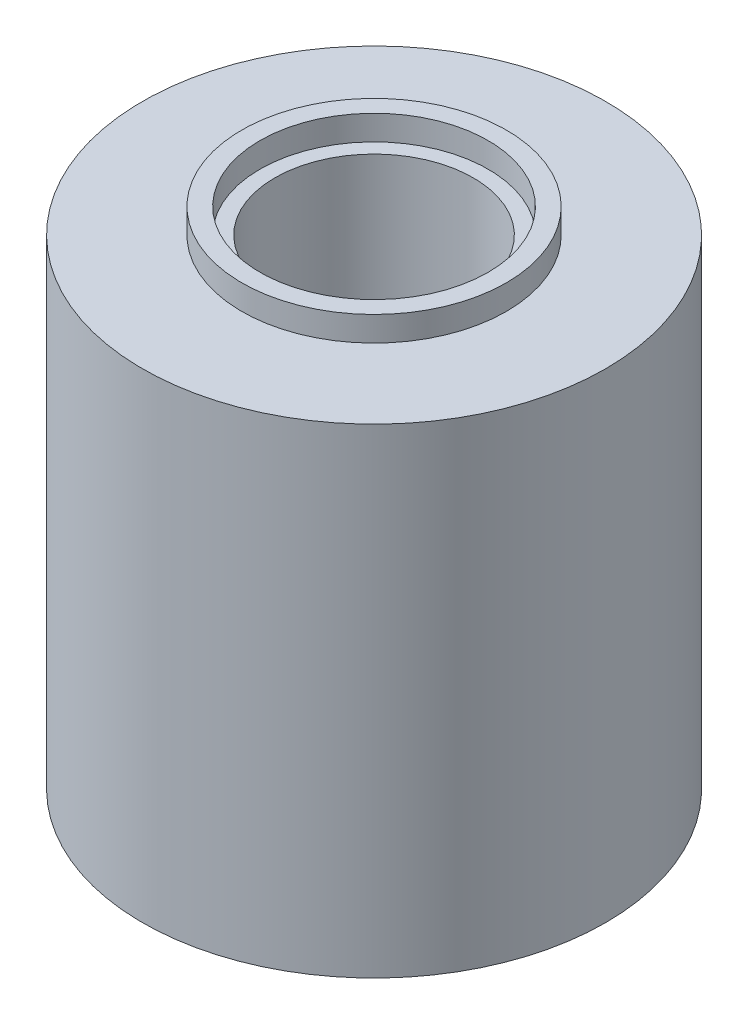
ISO-10303-21;
HEADER;
FILE_DESCRIPTION(('STEP AP214'),'2;1');
FILE_NAME('part.step','',(''),(''),'','','');
FILE_SCHEMA(('AUTOMOTIVE_DESIGN { 1 0 10303 214 1 1 1 1 }'));
ENDSEC;
DATA;
#1=APPLICATION_CONTEXT('core data for automotive mechanical design processes');
#2=APPLICATION_PROTOCOL_DEFINITION('international standard','automotive_design',2000,#1);
#3=PRODUCT_CONTEXT('',#1,'mechanical');
#4=PRODUCT('Part','Part','',(#3));
#5=PRODUCT_RELATED_PRODUCT_CATEGORY('part','',(#4));
#6=PRODUCT_DEFINITION_FORMATION('','',#4);
#7=PRODUCT_DEFINITION_CONTEXT('part definition',#1,'design');
#8=PRODUCT_DEFINITION('design','',#6,#7);
#9=PRODUCT_DEFINITION_SHAPE('','',#8);
#10=(LENGTH_UNIT() NAMED_UNIT(*) SI_UNIT(.MILLI.,.METRE.));
#11=(NAMED_UNIT(*) PLANE_ANGLE_UNIT() SI_UNIT($,.RADIAN.));
#12=(NAMED_UNIT(*) SI_UNIT($,.STERADIAN.) SOLID_ANGLE_UNIT());
#13=UNCERTAINTY_MEASURE_WITH_UNIT(LENGTH_MEASURE(1.E-05),#10,'distance_accuracy_value','');
#14=(GEOMETRIC_REPRESENTATION_CONTEXT(3) GLOBAL_UNCERTAINTY_ASSIGNED_CONTEXT((#13)) GLOBAL_UNIT_ASSIGNED_CONTEXT((#10,
#11,#12)) REPRESENTATION_CONTEXT('',''));
#15=CARTESIAN_POINT('',(0.,0.,0.));
#16=DIRECTION('',(0.,0.,1.));
#17=DIRECTION('',(1.,0.,0.));
#18=AXIS2_PLACEMENT_3D('',#15,#16,#17);
#19=CARTESIAN_POINT('',(8.,0.,0.));
#20=DIRECTION('',(0.,-1.,0.));
#21=DIRECTION('',(1.,0.,0.));
#22=AXIS2_PLACEMENT_3D('',#19,#20,#21);
#23=PLANE('',#22);
#24=CARTESIAN_POINT('',(0.,0.,0.));
#25=DIRECTION('',(0.,-1.,0.));
#26=DIRECTION('',(1.,0.,0.));
#27=AXIS2_PLACEMENT_3D('',#24,#25,#26);
#28=CIRCLE('',#27,8.);
#29=CARTESIAN_POINT('',(8.,0.,0.));
#30=VERTEX_POINT('',#29);
#31=EDGE_CURVE('E70',#30,#30,#28,.T.);
#32=ORIENTED_EDGE('',*,*,#31,.T.);
#33=EDGE_LOOP('',(#32));
#34=FACE_BOUND('',#33,.T.);
#35=CARTESIAN_POINT('',(0.,0.,0.));
#36=DIRECTION('',(0.,-1.,0.));
#37=DIRECTION('',(1.,0.,0.));
#38=AXIS2_PLACEMENT_3D('',#35,#36,#37);
#39=CIRCLE('',#38,6.9);
#40=CARTESIAN_POINT('',(6.9,0.,0.));
#41=VERTEX_POINT('',#40);
#42=EDGE_CURVE('E10',#41,#41,#39,.T.);
#43=ORIENTED_EDGE('',*,*,#42,.F.);
#44=EDGE_LOOP('',(#43));
#45=FACE_BOUND('',#44,.T.);
#46=ADVANCED_FACE('F30',(#34,#45),#23,.T.);
#47=CARTESIAN_POINT('',(0.,0.,0.));
#48=DIRECTION('',(0.,-1.,0.));
#49=DIRECTION('',(1.,0.,0.));
#50=AXIS2_PLACEMENT_3D('',#47,#48,#49);
#51=CYLINDRICAL_SURFACE('',#50,6.9);
#52=ORIENTED_EDGE('',*,*,#42,.T.);
#53=EDGE_LOOP('',(#52));
#54=FACE_BOUND('',#53,.T.);
#55=CARTESIAN_POINT('',(0.,1.5,0.));
#56=DIRECTION('',(0.,-1.,0.));
#57=DIRECTION('',(1.,0.,0.));
#58=AXIS2_PLACEMENT_3D('',#55,#56,#57);
#59=CIRCLE('',#58,6.9);
#60=CARTESIAN_POINT('',(6.9,1.5,0.));
#61=VERTEX_POINT('',#60);
#62=EDGE_CURVE('E36',#61,#61,#59,.T.);
#63=ORIENTED_EDGE('',*,*,#62,.F.);
#64=EDGE_LOOP('',(#63));
#65=FACE_BOUND('',#64,.T.);
#66=ADVANCED_FACE('F88',(#54,#65),#51,.F.);
#67=CARTESIAN_POINT('',(6.9,1.5,0.));
#68=DIRECTION('',(0.,-1.,0.));
#69=DIRECTION('',(1.,0.,0.));
#70=AXIS2_PLACEMENT_3D('',#67,#68,#69);
#71=PLANE('',#70);
#72=ORIENTED_EDGE('',*,*,#62,.T.);
#73=EDGE_LOOP('',(#72));
#74=FACE_BOUND('',#73,.T.);
#75=CARTESIAN_POINT('',(0.,1.5,0.));
#76=DIRECTION('',(0.,-1.,0.));
#77=DIRECTION('',(1.,0.,0.));
#78=AXIS2_PLACEMENT_3D('',#75,#76,#77);
#79=CIRCLE('',#78,6.);
#80=CARTESIAN_POINT('',(6.,1.5,0.));
#81=VERTEX_POINT('',#80);
#82=EDGE_CURVE('E40',#81,#81,#79,.T.);
#83=ORIENTED_EDGE('',*,*,#82,.F.);
#84=EDGE_LOOP('',(#83));
#85=FACE_BOUND('',#84,.T.);
#86=ADVANCED_FACE('F92',(#74,#85),#71,.T.);
#87=CARTESIAN_POINT('',(0.,0.,0.));
#88=DIRECTION('',(0.,-1.,0.));
#89=DIRECTION('',(1.,0.,0.));
#90=AXIS2_PLACEMENT_3D('',#87,#88,#89);
#91=CYLINDRICAL_SURFACE('',#90,6.);
#92=ORIENTED_EDGE('',*,*,#82,.T.);
#93=EDGE_LOOP('',(#92));
#94=FACE_BOUND('',#93,.T.);
#95=CARTESIAN_POINT('',(0.,30.5,0.));
#96=DIRECTION('',(0.,-1.,0.));
#97=DIRECTION('',(1.,0.,0.));
#98=AXIS2_PLACEMENT_3D('',#95,#96,#97);
#99=CIRCLE('',#98,6.);
#100=CARTESIAN_POINT('',(6.,30.5,0.));
#101=VERTEX_POINT('',#100);
#102=EDGE_CURVE('E44',#101,#101,#99,.T.);
#103=ORIENTED_EDGE('',*,*,#102,.F.);
#104=EDGE_LOOP('',(#103));
#105=FACE_BOUND('',#104,.T.);
#106=ADVANCED_FACE('F96',(#94,#105),#91,.F.);
#107=CARTESIAN_POINT('',(6.9,30.5,0.));
#108=DIRECTION('',(0.,1.,0.));
#109=DIRECTION('',(-1.,0.,0.));
#110=AXIS2_PLACEMENT_3D('',#107,#108,#109);
#111=PLANE('',#110);
#112=ORIENTED_EDGE('',*,*,#102,.T.);
#113=EDGE_LOOP('',(#112));
#114=FACE_BOUND('',#113,.T.);
#115=CARTESIAN_POINT('',(0.,30.5,0.));
#116=DIRECTION('',(0.,-1.,0.));
#117=DIRECTION('',(1.,0.,0.));
#118=AXIS2_PLACEMENT_3D('',#115,#116,#117);
#119=CIRCLE('',#118,6.9);
#120=CARTESIAN_POINT('',(6.9,30.5,0.));
#121=VERTEX_POINT('',#120);
#122=EDGE_CURVE('E49',#121,#121,#119,.T.);
#123=ORIENTED_EDGE('',*,*,#122,.F.);
#124=EDGE_LOOP('',(#123));
#125=FACE_BOUND('',#124,.T.);
#126=ADVANCED_FACE('F102',(#114,#125),#111,.T.);
#127=CARTESIAN_POINT('',(0.,0.,0.));
#128=DIRECTION('',(0.,-1.,0.));
#129=DIRECTION('',(1.,0.,0.));
#130=AXIS2_PLACEMENT_3D('',#127,#128,#129);
#131=CYLINDRICAL_SURFACE('',#130,6.9);
#132=ORIENTED_EDGE('',*,*,#122,.T.);
#133=EDGE_LOOP('',(#132));
#134=FACE_BOUND('',#133,.T.);
#135=CARTESIAN_POINT('',(0.,32.,0.));
#136=DIRECTION('',(0.,-1.,0.));
#137=DIRECTION('',(1.,0.,0.));
#138=AXIS2_PLACEMENT_3D('',#135,#136,#137);
#139=CIRCLE('',#138,6.9);
#140=CARTESIAN_POINT('',(6.9,32.,0.));
#141=VERTEX_POINT('',#140);
#142=EDGE_CURVE('E52',#141,#141,#139,.T.);
#143=ORIENTED_EDGE('',*,*,#142,.F.);
#144=EDGE_LOOP('',(#143));
#145=FACE_BOUND('',#144,.T.);
#146=ADVANCED_FACE('F106',(#134,#145),#131,.F.);
#147=CARTESIAN_POINT('',(8.,32.,0.));
#148=DIRECTION('',(0.,1.,0.));
#149=DIRECTION('',(-1.,0.,0.));
#150=AXIS2_PLACEMENT_3D('',#147,#148,#149);
#151=PLANE('',#150);
#152=ORIENTED_EDGE('',*,*,#142,.T.);
#153=EDGE_LOOP('',(#152));
#154=FACE_BOUND('',#153,.T.);
#155=CARTESIAN_POINT('',(0.,32.,0.));
#156=DIRECTION('',(0.,-1.,0.));
#157=DIRECTION('',(1.,0.,0.));
#158=AXIS2_PLACEMENT_3D('',#155,#156,#157);
#159=CIRCLE('',#158,8.);
#160=CARTESIAN_POINT('',(8.,32.,0.));
#161=VERTEX_POINT('',#160);
#162=EDGE_CURVE('E55',#161,#161,#159,.T.);
#163=ORIENTED_EDGE('',*,*,#162,.F.);
#164=EDGE_LOOP('',(#163));
#165=FACE_BOUND('',#164,.T.);
#166=ADVANCED_FACE('F110',(#154,#165),#151,.T.);
#167=CARTESIAN_POINT('',(0.,0.,0.));
#168=DIRECTION('',(0.,-1.,0.));
#169=DIRECTION('',(1.,0.,0.));
#170=AXIS2_PLACEMENT_3D('',#167,#168,#169);
#171=CYLINDRICAL_SURFACE('',#170,8.);
#172=ORIENTED_EDGE('',*,*,#162,.T.);
#173=EDGE_LOOP('',(#172));
#174=FACE_BOUND('',#173,.T.);
#175=CARTESIAN_POINT('',(0.,30.5,0.));
#176=DIRECTION('',(0.,-1.,0.));
#177=DIRECTION('',(1.,0.,0.));
#178=AXIS2_PLACEMENT_3D('',#175,#176,#177);
#179=CIRCLE('',#178,8.);
#180=CARTESIAN_POINT('',(8.,30.5,0.));
#181=VERTEX_POINT('',#180);
#182=EDGE_CURVE('E58',#181,#181,#179,.T.);
#183=ORIENTED_EDGE('',*,*,#182,.F.);
#184=EDGE_LOOP('',(#183));
#185=FACE_BOUND('',#184,.T.);
#186=ADVANCED_FACE('F114',(#174,#185),#171,.T.);
#187=CARTESIAN_POINT('',(8.,30.5,0.));
#188=DIRECTION('',(0.,1.,0.));
#189=DIRECTION('',(-1.,0.,0.));
#190=AXIS2_PLACEMENT_3D('',#187,#188,#189);
#191=PLANE('',#190);
#192=ORIENTED_EDGE('',*,*,#182,.T.);
#193=EDGE_LOOP('',(#192));
#194=FACE_BOUND('',#193,.T.);
#195=CARTESIAN_POINT('',(0.,30.5,0.));
#196=DIRECTION('',(0.,-1.,0.));
#197=DIRECTION('',(1.,0.,0.));
#198=AXIS2_PLACEMENT_3D('',#195,#196,#197);
#199=CIRCLE('',#198,14.);
#200=CARTESIAN_POINT('',(14.,30.5,0.));
#201=VERTEX_POINT('',#200);
#202=EDGE_CURVE('E61',#201,#201,#199,.T.);
#203=ORIENTED_EDGE('',*,*,#202,.F.);
#204=EDGE_LOOP('',(#203));
#205=FACE_BOUND('',#204,.T.);
#206=ADVANCED_FACE('F118',(#194,#205),#191,.T.);
#207=CARTESIAN_POINT('',(0.,0.,0.));
#208=DIRECTION('',(0.,-1.,0.));
#209=DIRECTION('',(1.,0.,0.));
#210=AXIS2_PLACEMENT_3D('',#207,#208,#209);
#211=CYLINDRICAL_SURFACE('',#210,14.);
#212=ORIENTED_EDGE('',*,*,#202,.T.);
#213=EDGE_LOOP('',(#212));
#214=FACE_BOUND('',#213,.T.);
#215=CARTESIAN_POINT('',(0.,1.5,0.));
#216=DIRECTION('',(0.,-1.,0.));
#217=DIRECTION('',(1.,0.,0.));
#218=AXIS2_PLACEMENT_3D('',#215,#216,#217);
#219=CIRCLE('',#218,14.);
#220=CARTESIAN_POINT('',(14.,1.5,0.));
#221=VERTEX_POINT('',#220);
#222=EDGE_CURVE('E64',#221,#221,#219,.T.);
#223=ORIENTED_EDGE('',*,*,#222,.F.);
#224=EDGE_LOOP('',(#223));
#225=FACE_BOUND('',#224,.T.);
#226=ADVANCED_FACE('F84',(#214,#225),#211,.T.);
#227=CARTESIAN_POINT('',(8.,1.5,0.));
#228=DIRECTION('',(0.,-1.,0.));
#229=DIRECTION('',(1.,0.,0.));
#230=AXIS2_PLACEMENT_3D('',#227,#228,#229);
#231=PLANE('',#230);
#232=ORIENTED_EDGE('',*,*,#222,.T.);
#233=EDGE_LOOP('',(#232));
#234=FACE_BOUND('',#233,.T.);
#235=CARTESIAN_POINT('',(0.,1.5,0.));
#236=DIRECTION('',(0.,-1.,0.));
#237=DIRECTION('',(1.,0.,0.));
#238=AXIS2_PLACEMENT_3D('',#235,#236,#237);
#239=CIRCLE('',#238,8.);
#240=CARTESIAN_POINT('',(8.,1.5,0.));
#241=VERTEX_POINT('',#240);
#242=EDGE_CURVE('E67',#241,#241,#239,.T.);
#243=ORIENTED_EDGE('',*,*,#242,.F.);
#244=EDGE_LOOP('',(#243));
#245=FACE_BOUND('',#244,.T.);
#246=ADVANCED_FACE('F78',(#234,#245),#231,.T.);
#247=CARTESIAN_POINT('',(0.,0.,0.));
#248=DIRECTION('',(0.,-1.,0.));
#249=DIRECTION('',(1.,0.,0.));
#250=AXIS2_PLACEMENT_3D('',#247,#248,#249);
#251=CYLINDRICAL_SURFACE('',#250,8.);
#252=ORIENTED_EDGE('',*,*,#242,.T.);
#253=EDGE_LOOP('',(#252));
#254=FACE_BOUND('',#253,.T.);
#255=ORIENTED_EDGE('',*,*,#31,.F.);
#256=EDGE_LOOP('',(#255));
#257=FACE_BOUND('',#256,.T.);
#258=ADVANCED_FACE('F76',(#254,#257),#251,.T.);
#259=CLOSED_SHELL('',(#46,#66,#86,#106,#126,#146,#166,#186,#206,#226,#246,#258));
#260=MANIFOLD_SOLID_BREP('B2',#259);
#261=ADVANCED_BREP_SHAPE_REPRESENTATION('',(#18,#260),#14);
#262=SHAPE_DEFINITION_REPRESENTATION(#9,#261);
ENDSEC;
END-ISO-10303-21;
